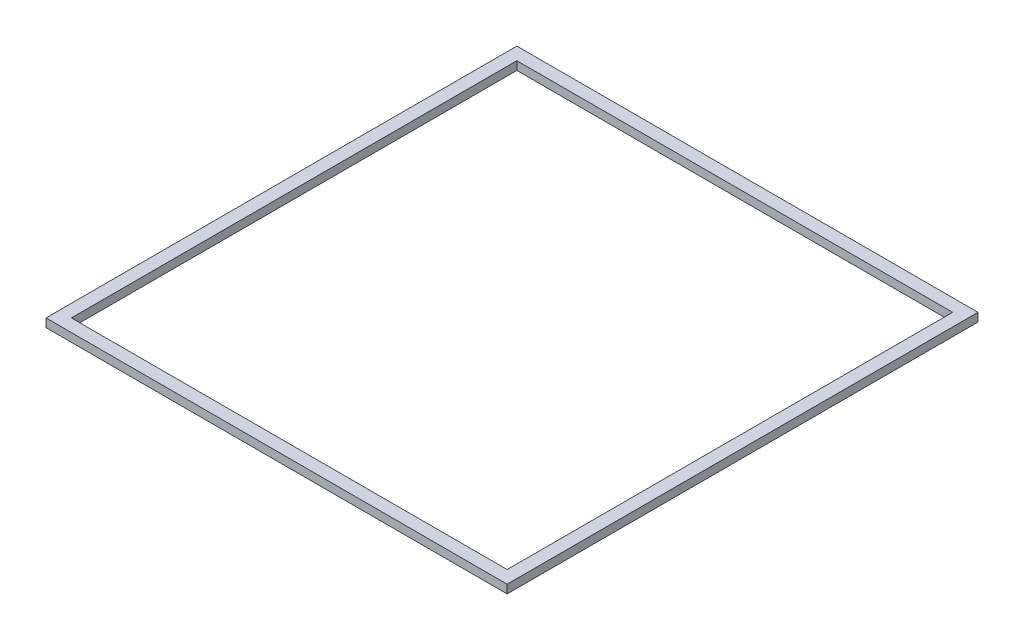
ISO-10303-21;
HEADER;
FILE_DESCRIPTION(('STEP AP214'),'2;1');
FILE_NAME('part.step','',(''),(''),'','','');
FILE_SCHEMA(('AUTOMOTIVE_DESIGN { 1 0 10303 214 1 1 1 1 }'));
ENDSEC;
DATA;
#1=APPLICATION_CONTEXT('core data for automotive mechanical design processes');
#2=APPLICATION_PROTOCOL_DEFINITION('international standard','automotive_design',2000,#1);
#3=PRODUCT_CONTEXT('',#1,'mechanical');
#4=PRODUCT('Part','Part','',(#3));
#5=PRODUCT_RELATED_PRODUCT_CATEGORY('part','',(#4));
#6=PRODUCT_DEFINITION_FORMATION('','',#4);
#7=PRODUCT_DEFINITION_CONTEXT('part definition',#1,'design');
#8=PRODUCT_DEFINITION('design','',#6,#7);
#9=PRODUCT_DEFINITION_SHAPE('','',#8);
#10=(LENGTH_UNIT() NAMED_UNIT(*) SI_UNIT(.MILLI.,.METRE.));
#11=(NAMED_UNIT(*) PLANE_ANGLE_UNIT() SI_UNIT($,.RADIAN.));
#12=(NAMED_UNIT(*) SI_UNIT($,.STERADIAN.) SOLID_ANGLE_UNIT());
#13=UNCERTAINTY_MEASURE_WITH_UNIT(LENGTH_MEASURE(1.E-05),#10,'distance_accuracy_value','');
#14=(GEOMETRIC_REPRESENTATION_CONTEXT(3) GLOBAL_UNCERTAINTY_ASSIGNED_CONTEXT((#13)) GLOBAL_UNIT_ASSIGNED_CONTEXT((#10,
#11,#12)) REPRESENTATION_CONTEXT('',''));
#15=CARTESIAN_POINT('',(0.,0.,0.));
#16=DIRECTION('',(0.,0.,1.));
#17=DIRECTION('',(1.,0.,0.));
#18=AXIS2_PLACEMENT_3D('',#15,#16,#17);
#19=CARTESIAN_POINT('',(0.,1.5875,0.));
#20=DIRECTION('',(0.,-1.,0.));
#21=DIRECTION('',(0.,0.,-1.));
#22=AXIS2_PLACEMENT_3D('',#19,#20,#21);
#23=PLANE('',#22);
#24=DIRECTION('',(0.,0.,1.));
#25=VECTOR('',#24,1.);
#26=CARTESIAN_POINT('',(0.,1.5875,0.));
#27=LINE('',#26,#25);
#28=CARTESIAN_POINT('',(0.,1.5875,-88.4125));
#29=VERTEX_POINT('',#28);
#30=CARTESIAN_POINT('',(0.,1.5875,0.));
#31=VERTEX_POINT('',#30);
#32=EDGE_CURVE('E141',#29,#31,#27,.T.);
#33=ORIENTED_EDGE('',*,*,#32,.T.);
#34=DIRECTION('',(1.,0.,0.));
#35=VECTOR('',#34,1.);
#36=CARTESIAN_POINT('',(0.,1.5875,0.));
#37=LINE('',#36,#35);
#38=CARTESIAN_POINT('',(86.5875,1.5875,0.));
#39=VERTEX_POINT('',#38);
#40=EDGE_CURVE('E144',#31,#39,#37,.T.);
#41=ORIENTED_EDGE('',*,*,#40,.T.);
#42=DIRECTION('',(0.,0.,-1.));
#43=VECTOR('',#42,1.);
#44=CARTESIAN_POINT('',(86.5875,1.5875,0.));
#45=LINE('',#44,#43);
#46=CARTESIAN_POINT('',(86.5875,1.5875,-88.4125));
#47=VERTEX_POINT('',#46);
#48=EDGE_CURVE('E147',#39,#47,#45,.T.);
#49=ORIENTED_EDGE('',*,*,#48,.T.);
#50=DIRECTION('',(-1.,0.,0.));
#51=VECTOR('',#50,1.);
#52=CARTESIAN_POINT('',(0.,1.5875,-88.4125));
#53=LINE('',#52,#51);
#54=EDGE_CURVE('E149',#47,#29,#53,.T.);
#55=ORIENTED_EDGE('',*,*,#54,.T.);
#56=EDGE_LOOP('',(#33,#41,#49,#55));
#57=FACE_BOUND('',#56,.T.);
#58=DIRECTION('',(0.,0.,1.));
#59=VECTOR('',#58,1.);
#60=CARTESIAN_POINT('',(2.38125,1.5875,-2.38125));
#61=LINE('',#60,#59);
#62=CARTESIAN_POINT('',(2.38125,1.5875,-86.03125));
#63=VERTEX_POINT('',#62);
#64=CARTESIAN_POINT('',(2.38125,1.5875,-2.38125));
#65=VERTEX_POINT('',#64);
#66=EDGE_CURVE('E105',#63,#65,#61,.T.);
#67=ORIENTED_EDGE('',*,*,#66,.F.);
#68=DIRECTION('',(-1.,0.,0.));
#69=VECTOR('',#68,1.);
#70=CARTESIAN_POINT('',(2.38125,1.5875,-86.03125));
#71=LINE('',#70,#69);
#72=CARTESIAN_POINT('',(84.20625,1.5875,-86.03125));
#73=VERTEX_POINT('',#72);
#74=EDGE_CURVE('E127',#73,#63,#71,.T.);
#75=ORIENTED_EDGE('',*,*,#74,.F.);
#76=DIRECTION('',(0.,0.,-1.));
#77=VECTOR('',#76,1.);
#78=CARTESIAN_POINT('',(84.20625,1.5875,-2.38125));
#79=LINE('',#78,#77);
#80=CARTESIAN_POINT('',(84.20625,1.5875,-2.38125));
#81=VERTEX_POINT('',#80);
#82=EDGE_CURVE('E125',#81,#73,#79,.T.);
#83=ORIENTED_EDGE('',*,*,#82,.F.);
#84=DIRECTION('',(1.,0.,0.));
#85=VECTOR('',#84,1.);
#86=CARTESIAN_POINT('',(2.38125,1.5875,-2.38125));
#87=LINE('',#86,#85);
#88=EDGE_CURVE('E113',#65,#81,#87,.T.);
#89=ORIENTED_EDGE('',*,*,#88,.F.);
#90=EDGE_LOOP('',(#67,#75,#83,#89));
#91=FACE_BOUND('',#90,.T.);
#92=ADVANCED_FACE('F40',(#57,#91),#23,.F.);
#93=CARTESIAN_POINT('',(0.,0.,0.));
#94=DIRECTION('',(0.,-1.,0.));
#95=DIRECTION('',(0.,0.,-1.));
#96=AXIS2_PLACEMENT_3D('',#93,#94,#95);
#97=PLANE('',#96);
#98=DIRECTION('',(0.,0.,1.));
#99=VECTOR('',#98,1.);
#100=CARTESIAN_POINT('',(0.,0.,0.));
#101=LINE('',#100,#99);
#102=CARTESIAN_POINT('',(0.,0.,-88.4125));
#103=VERTEX_POINT('',#102);
#104=CARTESIAN_POINT('',(0.,0.,0.));
#105=VERTEX_POINT('',#104);
#106=EDGE_CURVE('E121',#103,#105,#101,.T.);
#107=ORIENTED_EDGE('',*,*,#106,.F.);
#108=DIRECTION('',(-1.,0.,0.));
#109=VECTOR('',#108,1.);
#110=CARTESIAN_POINT('',(0.,0.,-88.4125));
#111=LINE('',#110,#109);
#112=CARTESIAN_POINT('',(86.5875,0.,-88.4125));
#113=VERTEX_POINT('',#112);
#114=EDGE_CURVE('E145',#113,#103,#111,.T.);
#115=ORIENTED_EDGE('',*,*,#114,.F.);
#116=DIRECTION('',(0.,0.,-1.));
#117=VECTOR('',#116,1.);
#118=CARTESIAN_POINT('',(86.5875,0.,0.));
#119=LINE('',#118,#117);
#120=CARTESIAN_POINT('',(86.5875,0.,0.));
#121=VERTEX_POINT('',#120);
#122=EDGE_CURVE('E156',#121,#113,#119,.T.);
#123=ORIENTED_EDGE('',*,*,#122,.F.);
#124=DIRECTION('',(1.,0.,0.));
#125=VECTOR('',#124,1.);
#126=CARTESIAN_POINT('',(0.,0.,0.));
#127=LINE('',#126,#125);
#128=EDGE_CURVE('E154',#105,#121,#127,.T.);
#129=ORIENTED_EDGE('',*,*,#128,.F.);
#130=EDGE_LOOP('',(#107,#115,#123,#129));
#131=FACE_BOUND('',#130,.T.);
#132=DIRECTION('',(-1.,0.,0.));
#133=VECTOR('',#132,1.);
#134=CARTESIAN_POINT('',(2.38125,0.,-86.03125));
#135=LINE('',#134,#133);
#136=CARTESIAN_POINT('',(84.20625,0.,-86.03125));
#137=VERTEX_POINT('',#136);
#138=CARTESIAN_POINT('',(2.38125,0.,-86.03125));
#139=VERTEX_POINT('',#138);
#140=EDGE_CURVE('E114',#137,#139,#135,.T.);
#141=ORIENTED_EDGE('',*,*,#140,.T.);
#142=DIRECTION('',(0.,0.,1.));
#143=VECTOR('',#142,1.);
#144=CARTESIAN_POINT('',(2.38125,0.,-2.38125));
#145=LINE('',#144,#143);
#146=CARTESIAN_POINT('',(2.38125,0.,-2.38125));
#147=VERTEX_POINT('',#146);
#148=EDGE_CURVE('E63',#139,#147,#145,.T.);
#149=ORIENTED_EDGE('',*,*,#148,.T.);
#150=DIRECTION('',(1.,0.,0.));
#151=VECTOR('',#150,1.);
#152=CARTESIAN_POINT('',(2.38125,0.,-2.38125));
#153=LINE('',#152,#151);
#154=CARTESIAN_POINT('',(84.20625,0.,-2.38125));
#155=VERTEX_POINT('',#154);
#156=EDGE_CURVE('E120',#147,#155,#153,.T.);
#157=ORIENTED_EDGE('',*,*,#156,.T.);
#158=DIRECTION('',(0.,0.,-1.));
#159=VECTOR('',#158,1.);
#160=CARTESIAN_POINT('',(84.20625,0.,-2.38125));
#161=LINE('',#160,#159);
#162=EDGE_CURVE('E133',#155,#137,#161,.T.);
#163=ORIENTED_EDGE('',*,*,#162,.T.);
#164=EDGE_LOOP('',(#141,#149,#157,#163));
#165=FACE_BOUND('',#164,.T.);
#166=ADVANCED_FACE('F174',(#131,#165),#97,.T.);
#167=CARTESIAN_POINT('',(0.,1.5875,0.));
#168=DIRECTION('',(1.,0.,0.));
#169=DIRECTION('',(0.,0.,-1.));
#170=AXIS2_PLACEMENT_3D('',#167,#168,#169);
#171=PLANE('',#170);
#172=ORIENTED_EDGE('',*,*,#106,.T.);
#173=DIRECTION('',(0.,-1.,0.));
#174=VECTOR('',#173,1.);
#175=CARTESIAN_POINT('',(0.,1.5875,0.));
#176=LINE('',#175,#174);
#177=EDGE_CURVE('E11',#31,#105,#176,.T.);
#178=ORIENTED_EDGE('',*,*,#177,.F.);
#179=ORIENTED_EDGE('',*,*,#32,.F.);
#180=DIRECTION('',(0.,-1.,0.));
#181=VECTOR('',#180,1.);
#182=CARTESIAN_POINT('',(0.,1.5875,-88.4125));
#183=LINE('',#182,#181);
#184=EDGE_CURVE('E151',#29,#103,#183,.T.);
#185=ORIENTED_EDGE('',*,*,#184,.T.);
#186=EDGE_LOOP('',(#172,#178,#179,#185));
#187=FACE_BOUND('',#186,.T.);
#188=ADVANCED_FACE('F42',(#187),#171,.F.);
#189=CARTESIAN_POINT('',(0.,1.5875,0.));
#190=DIRECTION('',(0.,0.,-1.));
#191=DIRECTION('',(-1.,0.,0.));
#192=AXIS2_PLACEMENT_3D('',#189,#190,#191);
#193=PLANE('',#192);
#194=ORIENTED_EDGE('',*,*,#128,.T.);
#195=DIRECTION('',(0.,-1.,0.));
#196=VECTOR('',#195,1.);
#197=CARTESIAN_POINT('',(86.5875,1.5875,0.));
#198=LINE('',#197,#196);
#199=EDGE_CURVE('E48',#39,#121,#198,.T.);
#200=ORIENTED_EDGE('',*,*,#199,.F.);
#201=ORIENTED_EDGE('',*,*,#40,.F.);
#202=ORIENTED_EDGE('',*,*,#177,.T.);
#203=EDGE_LOOP('',(#194,#200,#201,#202));
#204=FACE_BOUND('',#203,.T.);
#205=ADVANCED_FACE('F184',(#204),#193,.F.);
#206=CARTESIAN_POINT('',(86.5875,1.5875,0.));
#207=DIRECTION('',(-1.,0.,0.));
#208=DIRECTION('',(0.,0.,1.));
#209=AXIS2_PLACEMENT_3D('',#206,#207,#208);
#210=PLANE('',#209);
#211=ORIENTED_EDGE('',*,*,#122,.T.);
#212=DIRECTION('',(0.,-1.,0.));
#213=VECTOR('',#212,1.);
#214=CARTESIAN_POINT('',(86.5875,1.5875,-88.4125));
#215=LINE('',#214,#213);
#216=EDGE_CURVE('E161',#47,#113,#215,.T.);
#217=ORIENTED_EDGE('',*,*,#216,.F.);
#218=ORIENTED_EDGE('',*,*,#48,.F.);
#219=ORIENTED_EDGE('',*,*,#199,.T.);
#220=EDGE_LOOP('',(#211,#217,#218,#219));
#221=FACE_BOUND('',#220,.T.);
#222=ADVANCED_FACE('F168',(#221),#210,.F.);
#223=CARTESIAN_POINT('',(0.,1.5875,-88.4125));
#224=DIRECTION('',(0.,0.,1.));
#225=DIRECTION('',(1.,0.,0.));
#226=AXIS2_PLACEMENT_3D('',#223,#224,#225);
#227=PLANE('',#226);
#228=ORIENTED_EDGE('',*,*,#114,.T.);
#229=ORIENTED_EDGE('',*,*,#184,.F.);
#230=ORIENTED_EDGE('',*,*,#54,.F.);
#231=ORIENTED_EDGE('',*,*,#216,.T.);
#232=EDGE_LOOP('',(#228,#229,#230,#231));
#233=FACE_BOUND('',#232,.T.);
#234=ADVANCED_FACE('F178',(#233),#227,.F.);
#235=CARTESIAN_POINT('',(2.38125,1.5875,-2.38125));
#236=DIRECTION('',(1.,0.,0.));
#237=DIRECTION('',(0.,0.,-1.));
#238=AXIS2_PLACEMENT_3D('',#235,#236,#237);
#239=PLANE('',#238);
#240=ORIENTED_EDGE('',*,*,#148,.F.);
#241=DIRECTION('',(0.,-1.,0.));
#242=VECTOR('',#241,1.);
#243=CARTESIAN_POINT('',(2.38125,1.5875,-86.03125));
#244=LINE('',#243,#242);
#245=EDGE_CURVE('E109',#63,#139,#244,.T.);
#246=ORIENTED_EDGE('',*,*,#245,.F.);
#247=ORIENTED_EDGE('',*,*,#66,.T.);
#248=DIRECTION('',(0.,-1.,0.));
#249=VECTOR('',#248,1.);
#250=CARTESIAN_POINT('',(2.38125,1.5875,-2.38125));
#251=LINE('',#250,#249);
#252=EDGE_CURVE('E108',#65,#147,#251,.T.);
#253=ORIENTED_EDGE('',*,*,#252,.T.);
#254=EDGE_LOOP('',(#240,#246,#247,#253));
#255=FACE_BOUND('',#254,.T.);
#256=ADVANCED_FACE('F107',(#255),#239,.T.);
#257=CARTESIAN_POINT('',(2.38125,1.5875,-2.38125));
#258=DIRECTION('',(0.,0.,-1.));
#259=DIRECTION('',(-1.,0.,0.));
#260=AXIS2_PLACEMENT_3D('',#257,#258,#259);
#261=PLANE('',#260);
#262=ORIENTED_EDGE('',*,*,#156,.F.);
#263=ORIENTED_EDGE('',*,*,#252,.F.);
#264=ORIENTED_EDGE('',*,*,#88,.T.);
#265=DIRECTION('',(0.,-1.,0.));
#266=VECTOR('',#265,1.);
#267=CARTESIAN_POINT('',(84.20625,1.5875,-2.38125));
#268=LINE('',#267,#266);
#269=EDGE_CURVE('E122',#81,#155,#268,.T.);
#270=ORIENTED_EDGE('',*,*,#269,.T.);
#271=EDGE_LOOP('',(#262,#263,#264,#270));
#272=FACE_BOUND('',#271,.T.);
#273=ADVANCED_FACE('F117',(#272),#261,.T.);
#274=CARTESIAN_POINT('',(84.20625,1.5875,-2.38125));
#275=DIRECTION('',(-1.,0.,0.));
#276=DIRECTION('',(0.,0.,1.));
#277=AXIS2_PLACEMENT_3D('',#274,#275,#276);
#278=PLANE('',#277);
#279=ORIENTED_EDGE('',*,*,#162,.F.);
#280=ORIENTED_EDGE('',*,*,#269,.F.);
#281=ORIENTED_EDGE('',*,*,#82,.T.);
#282=DIRECTION('',(0.,-1.,0.));
#283=VECTOR('',#282,1.);
#284=CARTESIAN_POINT('',(84.20625,1.5875,-86.03125));
#285=LINE('',#284,#283);
#286=EDGE_CURVE('E55',#73,#137,#285,.T.);
#287=ORIENTED_EDGE('',*,*,#286,.T.);
#288=EDGE_LOOP('',(#279,#280,#281,#287));
#289=FACE_BOUND('',#288,.T.);
#290=ADVANCED_FACE('F207',(#289),#278,.T.);
#291=CARTESIAN_POINT('',(2.38125,1.5875,-86.03125));
#292=DIRECTION('',(0.,0.,1.));
#293=DIRECTION('',(1.,0.,0.));
#294=AXIS2_PLACEMENT_3D('',#291,#292,#293);
#295=PLANE('',#294);
#296=ORIENTED_EDGE('',*,*,#140,.F.);
#297=ORIENTED_EDGE('',*,*,#286,.F.);
#298=ORIENTED_EDGE('',*,*,#74,.T.);
#299=ORIENTED_EDGE('',*,*,#245,.T.);
#300=EDGE_LOOP('',(#296,#297,#298,#299));
#301=FACE_BOUND('',#300,.T.);
#302=ADVANCED_FACE('F211',(#301),#295,.T.);
#303=CLOSED_SHELL('',(#92,#166,#188,#205,#222,#234,#256,#273,#290,#302));
#304=MANIFOLD_SOLID_BREP('B2',#303);
#305=ADVANCED_BREP_SHAPE_REPRESENTATION('',(#18,#304),#14);
#306=SHAPE_DEFINITION_REPRESENTATION(#9,#305);
ENDSEC;
END-ISO-10303-21;
